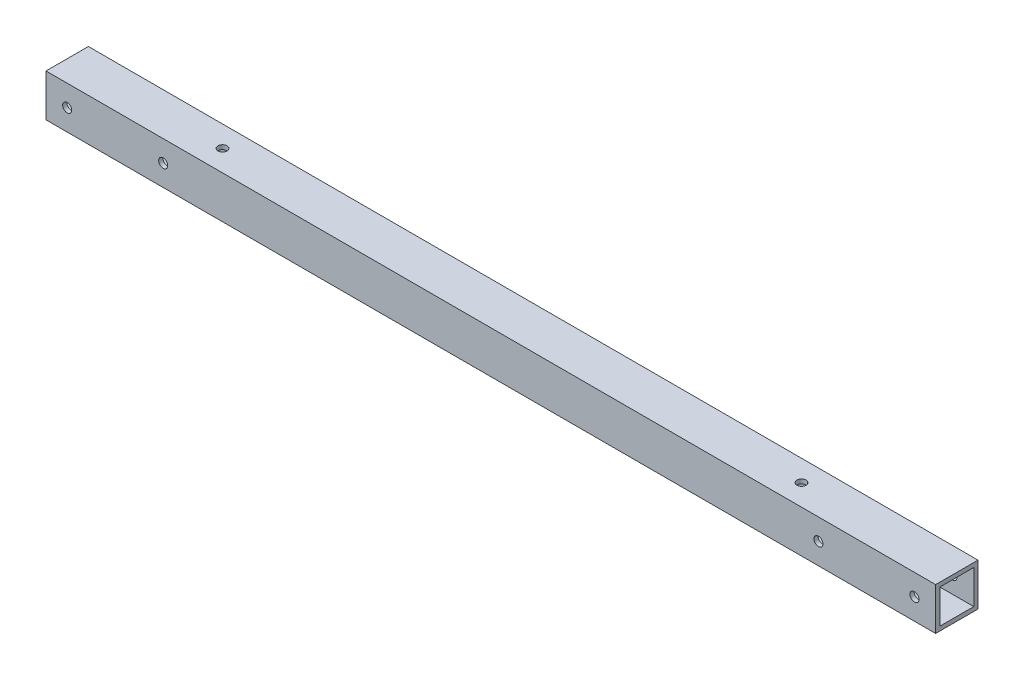
ISO-10303-21;
HEADER;
FILE_DESCRIPTION(('STEP AP214'),'2;1');
FILE_NAME('part.step','',(''),(''),'','','');
FILE_SCHEMA(('AUTOMOTIVE_DESIGN { 1 0 10303 214 1 1 1 1 }'));
ENDSEC;
DATA;
#1=APPLICATION_CONTEXT('core data for automotive mechanical design processes');
#2=APPLICATION_PROTOCOL_DEFINITION('international standard','automotive_design',2000,#1);
#3=PRODUCT_CONTEXT('',#1,'mechanical');
#4=PRODUCT('Part','Part','',(#3));
#5=PRODUCT_RELATED_PRODUCT_CATEGORY('part','',(#4));
#6=PRODUCT_DEFINITION_FORMATION('','',#4);
#7=PRODUCT_DEFINITION_CONTEXT('part definition',#1,'design');
#8=PRODUCT_DEFINITION('design','',#6,#7);
#9=PRODUCT_DEFINITION_SHAPE('','',#8);
#10=(LENGTH_UNIT() NAMED_UNIT(*) SI_UNIT(.MILLI.,.METRE.));
#11=(NAMED_UNIT(*) PLANE_ANGLE_UNIT() SI_UNIT($,.RADIAN.));
#12=(NAMED_UNIT(*) SI_UNIT($,.STERADIAN.) SOLID_ANGLE_UNIT());
#13=UNCERTAINTY_MEASURE_WITH_UNIT(LENGTH_MEASURE(1.E-05),#10,'distance_accuracy_value','');
#14=(GEOMETRIC_REPRESENTATION_CONTEXT(3) GLOBAL_UNCERTAINTY_ASSIGNED_CONTEXT((#13)) GLOBAL_UNIT_ASSIGNED_CONTEXT((#10,
#11,#12)) REPRESENTATION_CONTEXT('',''));
#15=CARTESIAN_POINT('',(0.,0.,0.));
#16=DIRECTION('',(0.,0.,1.));
#17=DIRECTION('',(1.,0.,0.));
#18=AXIS2_PLACEMENT_3D('',#15,#16,#17);
#19=CARTESIAN_POINT('',(7.5,-7.5,15.));
#20=DIRECTION('',(0.,0.,-1.));
#21=DIRECTION('',(-1.,0.,0.));
#22=AXIS2_PLACEMENT_3D('',#19,#20,#21);
#23=CYLINDRICAL_SURFACE('',#22,1.6);
#24=CARTESIAN_POINT('',(7.5,-7.5,13.5));
#25=DIRECTION('',(0.,0.,1.));
#26=DIRECTION('',(1.,0.,0.));
#27=AXIS2_PLACEMENT_3D('',#24,#25,#26);
#28=CIRCLE('',#27,1.6);
#29=CARTESIAN_POINT('',(9.1,-7.5,13.5));
#30=VERTEX_POINT('',#29);
#31=EDGE_CURVE('E166',#30,#30,#28,.T.);
#32=ORIENTED_EDGE('',*,*,#31,.F.);
#33=EDGE_LOOP('',(#32));
#34=FACE_BOUND('',#33,.T.);
#35=CARTESIAN_POINT('',(7.5,-7.5,15.));
#36=DIRECTION('',(0.,0.,1.));
#37=DIRECTION('',(1.,0.,0.));
#38=AXIS2_PLACEMENT_3D('',#35,#36,#37);
#39=CIRCLE('',#38,1.6);
#40=CARTESIAN_POINT('',(9.1,-7.5,15.));
#41=VERTEX_POINT('',#40);
#42=EDGE_CURVE('E188',#41,#41,#39,.T.);
#43=ORIENTED_EDGE('',*,*,#42,.T.);
#44=EDGE_LOOP('',(#43));
#45=FACE_BOUND('',#44,.T.);
#46=ADVANCED_FACE('F44',(#34,#45),#23,.F.);
#47=CARTESIAN_POINT('',(41.5,-7.5,15.));
#48=DIRECTION('',(0.,0.,-1.));
#49=DIRECTION('',(-1.,0.,0.));
#50=AXIS2_PLACEMENT_3D('',#47,#48,#49);
#51=CYLINDRICAL_SURFACE('',#50,1.6);
#52=CARTESIAN_POINT('',(41.5,-7.5,13.5));
#53=DIRECTION('',(0.,0.,1.));
#54=DIRECTION('',(1.,0.,0.));
#55=AXIS2_PLACEMENT_3D('',#52,#53,#54);
#56=CIRCLE('',#55,1.6);
#57=CARTESIAN_POINT('',(43.1,-7.5,13.5));
#58=VERTEX_POINT('',#57);
#59=EDGE_CURVE('E163',#58,#58,#56,.T.);
#60=ORIENTED_EDGE('',*,*,#59,.F.);
#61=EDGE_LOOP('',(#60));
#62=FACE_BOUND('',#61,.T.);
#63=CARTESIAN_POINT('',(41.5,-7.5,15.));
#64=DIRECTION('',(0.,0.,1.));
#65=DIRECTION('',(1.,0.,0.));
#66=AXIS2_PLACEMENT_3D('',#63,#64,#65);
#67=CIRCLE('',#66,1.6);
#68=CARTESIAN_POINT('',(43.1,-7.5,15.));
#69=VERTEX_POINT('',#68);
#70=EDGE_CURVE('E182',#69,#69,#67,.T.);
#71=ORIENTED_EDGE('',*,*,#70,.T.);
#72=EDGE_LOOP('',(#71));
#73=FACE_BOUND('',#72,.T.);
#74=ADVANCED_FACE('F277',(#62,#73),#51,.F.);
#75=CARTESIAN_POINT('',(273.5,-7.5,15.));
#76=DIRECTION('',(0.,0.,-1.));
#77=DIRECTION('',(-1.,0.,0.));
#78=AXIS2_PLACEMENT_3D('',#75,#76,#77);
#79=CYLINDRICAL_SURFACE('',#78,1.59999999999996);
#80=CARTESIAN_POINT('',(273.5,-7.5,13.5));
#81=DIRECTION('',(0.,0.,1.));
#82=DIRECTION('',(1.,0.,0.));
#83=AXIS2_PLACEMENT_3D('',#80,#81,#82);
#84=CIRCLE('',#83,1.59999999999996);
#85=CARTESIAN_POINT('',(275.1,-7.5,13.5));
#86=VERTEX_POINT('',#85);
#87=EDGE_CURVE('E160',#86,#86,#84,.T.);
#88=ORIENTED_EDGE('',*,*,#87,.F.);
#89=EDGE_LOOP('',(#88));
#90=FACE_BOUND('',#89,.T.);
#91=CARTESIAN_POINT('',(273.5,-7.5,15.));
#92=DIRECTION('',(0.,0.,1.));
#93=DIRECTION('',(1.,0.,0.));
#94=AXIS2_PLACEMENT_3D('',#91,#92,#93);
#95=CIRCLE('',#94,1.59999999999996);
#96=CARTESIAN_POINT('',(275.1,-7.5,15.));
#97=VERTEX_POINT('',#96);
#98=EDGE_CURVE('E176',#97,#97,#95,.T.);
#99=ORIENTED_EDGE('',*,*,#98,.T.);
#100=EDGE_LOOP('',(#99));
#101=FACE_BOUND('',#100,.T.);
#102=ADVANCED_FACE('F285',(#90,#101),#79,.F.);
#103=CARTESIAN_POINT('',(307.5,-7.5,15.));
#104=DIRECTION('',(0.,0.,-1.));
#105=DIRECTION('',(-1.,0.,0.));
#106=AXIS2_PLACEMENT_3D('',#103,#104,#105);
#107=CYLINDRICAL_SURFACE('',#106,1.59999999999996);
#108=CARTESIAN_POINT('',(307.5,-7.5,13.5));
#109=DIRECTION('',(0.,0.,1.));
#110=DIRECTION('',(1.,0.,0.));
#111=AXIS2_PLACEMENT_3D('',#108,#109,#110);
#112=CIRCLE('',#111,1.59999999999996);
#113=CARTESIAN_POINT('',(309.1,-7.5,13.5));
#114=VERTEX_POINT('',#113);
#115=EDGE_CURVE('E159',#114,#114,#112,.T.);
#116=ORIENTED_EDGE('',*,*,#115,.F.);
#117=EDGE_LOOP('',(#116));
#118=FACE_BOUND('',#117,.T.);
#119=CARTESIAN_POINT('',(307.5,-7.5,15.));
#120=DIRECTION('',(0.,0.,1.));
#121=DIRECTION('',(1.,0.,0.));
#122=AXIS2_PLACEMENT_3D('',#119,#120,#121);
#123=CIRCLE('',#122,1.59999999999996);
#124=CARTESIAN_POINT('',(309.1,-7.5,15.));
#125=VERTEX_POINT('',#124);
#126=EDGE_CURVE('E170',#125,#125,#123,.T.);
#127=ORIENTED_EDGE('',*,*,#126,.T.);
#128=EDGE_LOOP('',(#127));
#129=FACE_BOUND('',#128,.T.);
#130=ADVANCED_FACE('F273',(#118,#129),#107,.F.);
#131=CARTESIAN_POINT('',(0.,0.,15.));
#132=DIRECTION('',(0.,0.,1.));
#133=DIRECTION('',(1.,0.,0.));
#134=AXIS2_PLACEMENT_3D('',#131,#132,#133);
#135=PLANE('',#134);
#136=ORIENTED_EDGE('',*,*,#98,.F.);
#137=EDGE_LOOP('',(#136));
#138=FACE_BOUND('',#137,.T.);
#139=ORIENTED_EDGE('',*,*,#42,.F.);
#140=EDGE_LOOP('',(#139));
#141=FACE_BOUND('',#140,.T.);
#142=DIRECTION('',(0.,-1.,0.));
#143=VECTOR('',#142,1.);
#144=CARTESIAN_POINT('',(0.,0.,15.));
#145=LINE('',#144,#143);
#146=CARTESIAN_POINT('',(0.,0.,15.));
#147=VERTEX_POINT('',#146);
#148=CARTESIAN_POINT('',(0.,-15.,15.));
#149=VERTEX_POINT('',#148);
#150=EDGE_CURVE('E194',#147,#149,#145,.T.);
#151=ORIENTED_EDGE('',*,*,#150,.T.);
#152=DIRECTION('',(1.,0.,0.));
#153=VECTOR('',#152,1.);
#154=CARTESIAN_POINT('',(0.,-15.,15.));
#155=LINE('',#154,#153);
#156=CARTESIAN_POINT('',(315.,-15.,15.));
#157=VERTEX_POINT('',#156);
#158=EDGE_CURVE('E197',#149,#157,#155,.T.);
#159=ORIENTED_EDGE('',*,*,#158,.T.);
#160=DIRECTION('',(0.,1.,0.));
#161=VECTOR('',#160,1.);
#162=CARTESIAN_POINT('',(315.,0.,15.));
#163=LINE('',#162,#161);
#164=CARTESIAN_POINT('',(315.,0.,15.));
#165=VERTEX_POINT('',#164);
#166=EDGE_CURVE('E200',#157,#165,#163,.T.);
#167=ORIENTED_EDGE('',*,*,#166,.T.);
#168=DIRECTION('',(-1.,0.,0.));
#169=VECTOR('',#168,1.);
#170=CARTESIAN_POINT('',(0.,0.,15.));
#171=LINE('',#170,#169);
#172=EDGE_CURVE('E202',#165,#147,#171,.T.);
#173=ORIENTED_EDGE('',*,*,#172,.T.);
#174=EDGE_LOOP('',(#151,#159,#167,#173));
#175=FACE_BOUND('',#174,.T.);
#176=ORIENTED_EDGE('',*,*,#70,.F.);
#177=EDGE_LOOP('',(#176));
#178=FACE_BOUND('',#177,.T.);
#179=ORIENTED_EDGE('',*,*,#126,.F.);
#180=EDGE_LOOP('',(#179));
#181=FACE_BOUND('',#180,.T.);
#182=ADVANCED_FACE('F309',(#138,#141,#175,#178,#181),#135,.T.);
#183=CARTESIAN_POINT('',(0.,0.,0.));
#184=DIRECTION('',(0.,0.,1.));
#185=DIRECTION('',(1.,0.,0.));
#186=AXIS2_PLACEMENT_3D('',#183,#184,#185);
#187=PLANE('',#186);
#188=DIRECTION('',(0.,-1.,0.));
#189=VECTOR('',#188,1.);
#190=CARTESIAN_POINT('',(0.,0.,0.));
#191=LINE('',#190,#189);
#192=CARTESIAN_POINT('',(0.,0.,0.));
#193=VERTEX_POINT('',#192);
#194=CARTESIAN_POINT('',(0.,-15.,0.));
#195=VERTEX_POINT('',#194);
#196=EDGE_CURVE('E191',#193,#195,#191,.T.);
#197=ORIENTED_EDGE('',*,*,#196,.F.);
#198=DIRECTION('',(-1.,0.,0.));
#199=VECTOR('',#198,1.);
#200=CARTESIAN_POINT('',(0.,0.,0.));
#201=LINE('',#200,#199);
#202=CARTESIAN_POINT('',(315.,0.,0.));
#203=VERTEX_POINT('',#202);
#204=EDGE_CURVE('E198',#203,#193,#201,.T.);
#205=ORIENTED_EDGE('',*,*,#204,.F.);
#206=DIRECTION('',(0.,1.,0.));
#207=VECTOR('',#206,1.);
#208=CARTESIAN_POINT('',(315.,0.,0.));
#209=LINE('',#208,#207);
#210=CARTESIAN_POINT('',(315.,-15.,0.));
#211=VERTEX_POINT('',#210);
#212=EDGE_CURVE('E209',#211,#203,#209,.T.);
#213=ORIENTED_EDGE('',*,*,#212,.F.);
#214=DIRECTION('',(1.,0.,0.));
#215=VECTOR('',#214,1.);
#216=CARTESIAN_POINT('',(0.,-15.,0.));
#217=LINE('',#216,#215);
#218=EDGE_CURVE('E207',#195,#211,#217,.T.);
#219=ORIENTED_EDGE('',*,*,#218,.F.);
#220=EDGE_LOOP('',(#197,#205,#213,#219));
#221=FACE_BOUND('',#220,.T.);
#222=CARTESIAN_POINT('',(7.5,-7.5,0.));
#223=DIRECTION('',(0.,0.,1.));
#224=DIRECTION('',(1.,0.,0.));
#225=AXIS2_PLACEMENT_3D('',#222,#223,#224);
#226=CIRCLE('',#225,1.6);
#227=CARTESIAN_POINT('',(9.1,-7.5,0.));
#228=VERTEX_POINT('',#227);
#229=EDGE_CURVE('E185',#228,#228,#226,.T.);
#230=ORIENTED_EDGE('',*,*,#229,.T.);
#231=EDGE_LOOP('',(#230));
#232=FACE_BOUND('',#231,.T.);
#233=CARTESIAN_POINT('',(41.5,-7.5,0.));
#234=DIRECTION('',(0.,0.,1.));
#235=DIRECTION('',(1.,0.,0.));
#236=AXIS2_PLACEMENT_3D('',#233,#234,#235);
#237=CIRCLE('',#236,1.6);
#238=CARTESIAN_POINT('',(43.1,-7.5,0.));
#239=VERTEX_POINT('',#238);
#240=EDGE_CURVE('E179',#239,#239,#237,.T.);
#241=ORIENTED_EDGE('',*,*,#240,.T.);
#242=EDGE_LOOP('',(#241));
#243=FACE_BOUND('',#242,.T.);
#244=CARTESIAN_POINT('',(273.5,-7.5,0.));
#245=DIRECTION('',(0.,0.,1.));
#246=DIRECTION('',(1.,0.,0.));
#247=AXIS2_PLACEMENT_3D('',#244,#245,#246);
#248=CIRCLE('',#247,1.59999999999996);
#249=CARTESIAN_POINT('',(275.1,-7.5,0.));
#250=VERTEX_POINT('',#249);
#251=EDGE_CURVE('E173',#250,#250,#248,.T.);
#252=ORIENTED_EDGE('',*,*,#251,.T.);
#253=EDGE_LOOP('',(#252));
#254=FACE_BOUND('',#253,.T.);
#255=CARTESIAN_POINT('',(307.5,-7.5,0.));
#256=DIRECTION('',(0.,0.,1.));
#257=DIRECTION('',(1.,0.,0.));
#258=AXIS2_PLACEMENT_3D('',#255,#256,#257);
#259=CIRCLE('',#258,1.59999999999996);
#260=CARTESIAN_POINT('',(309.1,-7.5,0.));
#261=VERTEX_POINT('',#260);
#262=EDGE_CURVE('E169',#261,#261,#259,.T.);
#263=ORIENTED_EDGE('',*,*,#262,.T.);
#264=EDGE_LOOP('',(#263));
#265=FACE_BOUND('',#264,.T.);
#266=ADVANCED_FACE('F307',(#221,#232,#243,#254,#265),#187,.F.);
#267=CARTESIAN_POINT('',(0.,0.,15.));
#268=DIRECTION('',(1.,0.,0.));
#269=DIRECTION('',(0.,0.,-1.));
#270=AXIS2_PLACEMENT_3D('',#267,#268,#269);
#271=PLANE('',#270);
#272=DIRECTION('',(0.,-1.,0.));
#273=VECTOR('',#272,1.);
#274=CARTESIAN_POINT('',(0.,-1.5,13.5));
#275=LINE('',#274,#273);
#276=CARTESIAN_POINT('',(0.,-1.5,13.5));
#277=VERTEX_POINT('',#276);
#278=CARTESIAN_POINT('',(0.,-13.5,13.5));
#279=VERTEX_POINT('',#278);
#280=EDGE_CURVE('E119',#277,#279,#275,.T.);
#281=ORIENTED_EDGE('',*,*,#280,.T.);
#282=DIRECTION('',(0.,0.,-1.));
#283=VECTOR('',#282,1.);
#284=CARTESIAN_POINT('',(0.,-13.5,13.5));
#285=LINE('',#284,#283);
#286=CARTESIAN_POINT('',(0.,-13.5,1.5));
#287=VERTEX_POINT('',#286);
#288=EDGE_CURVE('E113',#279,#287,#285,.T.);
#289=ORIENTED_EDGE('',*,*,#288,.T.);
#290=DIRECTION('',(0.,1.,0.));
#291=VECTOR('',#290,1.);
#292=CARTESIAN_POINT('',(0.,-13.5,1.5));
#293=LINE('',#292,#291);
#294=CARTESIAN_POINT('',(0.,-1.5,1.5));
#295=VERTEX_POINT('',#294);
#296=EDGE_CURVE('E122',#287,#295,#293,.T.);
#297=ORIENTED_EDGE('',*,*,#296,.T.);
#298=DIRECTION('',(0.,0.,1.));
#299=VECTOR('',#298,1.);
#300=CARTESIAN_POINT('',(0.,-1.5,1.5));
#301=LINE('',#300,#299);
#302=EDGE_CURVE('E61',#295,#277,#301,.T.);
#303=ORIENTED_EDGE('',*,*,#302,.T.);
#304=EDGE_LOOP('',(#281,#289,#297,#303));
#305=FACE_BOUND('',#304,.T.);
#306=ORIENTED_EDGE('',*,*,#196,.T.);
#307=DIRECTION('',(0.,0.,-1.));
#308=VECTOR('',#307,1.);
#309=CARTESIAN_POINT('',(0.,-15.,15.));
#310=LINE('',#309,#308);
#311=EDGE_CURVE('E11',#149,#195,#310,.T.);
#312=ORIENTED_EDGE('',*,*,#311,.F.);
#313=ORIENTED_EDGE('',*,*,#150,.F.);
#314=DIRECTION('',(0.,0.,-1.));
#315=VECTOR('',#314,1.);
#316=CARTESIAN_POINT('',(0.,0.,15.));
#317=LINE('',#316,#315);
#318=EDGE_CURVE('E204',#147,#193,#317,.T.);
#319=ORIENTED_EDGE('',*,*,#318,.T.);
#320=EDGE_LOOP('',(#306,#312,#313,#319));
#321=FACE_BOUND('',#320,.T.);
#322=ADVANCED_FACE('F46',(#305,#321),#271,.F.);
#323=CARTESIAN_POINT('',(0.,-15.,15.));
#324=DIRECTION('',(0.,1.,0.));
#325=DIRECTION('',(0.,0.,1.));
#326=AXIS2_PLACEMENT_3D('',#323,#324,#325);
#327=PLANE('',#326);
#328=CARTESIAN_POINT('',(55.,-15.,7.50000000000003));
#329=DIRECTION('',(0.,1.,0.));
#330=DIRECTION('',(0.,0.,1.));
#331=AXIS2_PLACEMENT_3D('',#328,#329,#330);
#332=CIRCLE('',#331,1.60000000000001);
#333=CARTESIAN_POINT('',(55.,-15.,9.10000000000004));
#334=VERTEX_POINT('',#333);
#335=EDGE_CURVE('E225',#334,#334,#332,.T.);
#336=ORIENTED_EDGE('',*,*,#335,.T.);
#337=EDGE_LOOP('',(#336));
#338=FACE_BOUND('',#337,.T.);
#339=CARTESIAN_POINT('',(260.,-15.,7.50000000000001));
#340=DIRECTION('',(0.,1.,0.));
#341=DIRECTION('',(0.,0.,1.));
#342=AXIS2_PLACEMENT_3D('',#339,#340,#341);
#343=CIRCLE('',#342,1.59999999999996);
#344=CARTESIAN_POINT('',(260.,-15.,9.09999999999997));
#345=VERTEX_POINT('',#344);
#346=EDGE_CURVE('E240',#345,#345,#343,.T.);
#347=ORIENTED_EDGE('',*,*,#346,.T.);
#348=EDGE_LOOP('',(#347));
#349=FACE_BOUND('',#348,.T.);
#350=ORIENTED_EDGE('',*,*,#218,.T.);
#351=DIRECTION('',(0.,0.,-1.));
#352=VECTOR('',#351,1.);
#353=CARTESIAN_POINT('',(315.,-15.,15.));
#354=LINE('',#353,#352);
#355=EDGE_CURVE('E53',#157,#211,#354,.T.);
#356=ORIENTED_EDGE('',*,*,#355,.F.);
#357=ORIENTED_EDGE('',*,*,#158,.F.);
#358=ORIENTED_EDGE('',*,*,#311,.T.);
#359=EDGE_LOOP('',(#350,#356,#357,#358));
#360=FACE_BOUND('',#359,.T.);
#361=ADVANCED_FACE('F244',(#338,#349,#360),#327,.F.);
#362=CARTESIAN_POINT('',(315.,0.,15.));
#363=DIRECTION('',(-1.,0.,0.));
#364=DIRECTION('',(0.,0.,1.));
#365=AXIS2_PLACEMENT_3D('',#362,#363,#364);
#366=PLANE('',#365);
#367=DIRECTION('',(0.,1.,0.));
#368=VECTOR('',#367,1.);
#369=CARTESIAN_POINT('',(315.,-13.5,1.5));
#370=LINE('',#369,#368);
#371=CARTESIAN_POINT('',(315.,-13.5,1.5));
#372=VERTEX_POINT('',#371);
#373=CARTESIAN_POINT('',(315.,-1.5,1.5));
#374=VERTEX_POINT('',#373);
#375=EDGE_CURVE('E140',#372,#374,#370,.T.);
#376=ORIENTED_EDGE('',*,*,#375,.F.);
#377=DIRECTION('',(0.,0.,-1.));
#378=VECTOR('',#377,1.);
#379=CARTESIAN_POINT('',(315.,-13.5,13.5));
#380=LINE('',#379,#378);
#381=CARTESIAN_POINT('',(315.,-13.5,13.5));
#382=VERTEX_POINT('',#381);
#383=EDGE_CURVE('E69',#382,#372,#380,.T.);
#384=ORIENTED_EDGE('',*,*,#383,.F.);
#385=DIRECTION('',(0.,-1.,0.));
#386=VECTOR('',#385,1.);
#387=CARTESIAN_POINT('',(315.,-1.5,13.5));
#388=LINE('',#387,#386);
#389=CARTESIAN_POINT('',(315.,-1.5,13.5));
#390=VERTEX_POINT('',#389);
#391=EDGE_CURVE('E128',#390,#382,#388,.T.);
#392=ORIENTED_EDGE('',*,*,#391,.F.);
#393=DIRECTION('',(0.,0.,1.));
#394=VECTOR('',#393,1.);
#395=CARTESIAN_POINT('',(315.,-1.5,1.5));
#396=LINE('',#395,#394);
#397=EDGE_CURVE('E131',#374,#390,#396,.T.);
#398=ORIENTED_EDGE('',*,*,#397,.F.);
#399=EDGE_LOOP('',(#376,#384,#392,#398));
#400=FACE_BOUND('',#399,.T.);
#401=ORIENTED_EDGE('',*,*,#212,.T.);
#402=DIRECTION('',(0.,0.,-1.));
#403=VECTOR('',#402,1.);
#404=CARTESIAN_POINT('',(315.,0.,15.));
#405=LINE('',#404,#403);
#406=EDGE_CURVE('E214',#165,#203,#405,.T.);
#407=ORIENTED_EDGE('',*,*,#406,.F.);
#408=ORIENTED_EDGE('',*,*,#166,.F.);
#409=ORIENTED_EDGE('',*,*,#355,.T.);
#410=EDGE_LOOP('',(#401,#407,#408,#409));
#411=FACE_BOUND('',#410,.T.);
#412=ADVANCED_FACE('F300',(#400,#411),#366,.F.);
#413=CARTESIAN_POINT('',(0.,0.,15.));
#414=DIRECTION('',(0.,-1.,0.));
#415=DIRECTION('',(0.,0.,-1.));
#416=AXIS2_PLACEMENT_3D('',#413,#414,#415);
#417=PLANE('',#416);
#418=CARTESIAN_POINT('',(55.,0.,7.50000000000003));
#419=DIRECTION('',(0.,1.,0.));
#420=DIRECTION('',(0.,0.,1.));
#421=AXIS2_PLACEMENT_3D('',#418,#419,#420);
#422=CIRCLE('',#421,1.60000000000001);
#423=CARTESIAN_POINT('',(55.,0.,9.10000000000004));
#424=VERTEX_POINT('',#423);
#425=EDGE_CURVE('E230',#424,#424,#422,.T.);
#426=ORIENTED_EDGE('',*,*,#425,.F.);
#427=EDGE_LOOP('',(#426));
#428=FACE_BOUND('',#427,.T.);
#429=CARTESIAN_POINT('',(260.,0.,7.50000000000001));
#430=DIRECTION('',(0.,1.,0.));
#431=DIRECTION('',(0.,0.,1.));
#432=AXIS2_PLACEMENT_3D('',#429,#430,#431);
#433=CIRCLE('',#432,1.59999999999996);
#434=CARTESIAN_POINT('',(260.,0.,9.09999999999997));
#435=VERTEX_POINT('',#434);
#436=EDGE_CURVE('E235',#435,#435,#433,.T.);
#437=ORIENTED_EDGE('',*,*,#436,.F.);
#438=EDGE_LOOP('',(#437));
#439=FACE_BOUND('',#438,.T.);
#440=ORIENTED_EDGE('',*,*,#204,.T.);
#441=ORIENTED_EDGE('',*,*,#318,.F.);
#442=ORIENTED_EDGE('',*,*,#172,.F.);
#443=ORIENTED_EDGE('',*,*,#406,.T.);
#444=EDGE_LOOP('',(#440,#441,#442,#443));
#445=FACE_BOUND('',#444,.T.);
#446=ADVANCED_FACE('F293',(#428,#439,#445),#417,.F.);
#447=CARTESIAN_POINT('',(7.5,-7.5,1.5));
#448=DIRECTION('',(0.,0.,-1.));
#449=DIRECTION('',(-1.,0.,0.));
#450=AXIS2_PLACEMENT_3D('',#447,#448,#449);
#451=CIRCLE('',#450,1.6);
#452=CARTESIAN_POINT('',(5.9,-7.5,1.5));
#453=VERTEX_POINT('',#452);
#454=EDGE_CURVE('E156',#453,#453,#451,.T.);
#455=ORIENTED_EDGE('',*,*,#454,.F.);
#456=EDGE_LOOP('',(#455));
#457=FACE_BOUND('',#456,.T.);
#458=ORIENTED_EDGE('',*,*,#229,.F.);
#459=EDGE_LOOP('',(#458));
#460=FACE_BOUND('',#459,.T.);
#461=ADVANCED_FACE('F280',(#457,#460),#23,.F.);
#462=CARTESIAN_POINT('',(41.5,-7.5,1.5));
#463=DIRECTION('',(0.,0.,-1.));
#464=DIRECTION('',(-1.,0.,0.));
#465=AXIS2_PLACEMENT_3D('',#462,#463,#464);
#466=CIRCLE('',#465,1.6);
#467=CARTESIAN_POINT('',(39.9,-7.5,1.5));
#468=VERTEX_POINT('',#467);
#469=EDGE_CURVE('E153',#468,#468,#466,.T.);
#470=ORIENTED_EDGE('',*,*,#469,.F.);
#471=EDGE_LOOP('',(#470));
#472=FACE_BOUND('',#471,.T.);
#473=ORIENTED_EDGE('',*,*,#240,.F.);
#474=EDGE_LOOP('',(#473));
#475=FACE_BOUND('',#474,.T.);
#476=ADVANCED_FACE('F288',(#472,#475),#51,.F.);
#477=CARTESIAN_POINT('',(273.5,-7.5,1.5));
#478=DIRECTION('',(0.,0.,-1.));
#479=DIRECTION('',(-1.,0.,0.));
#480=AXIS2_PLACEMENT_3D('',#477,#478,#479);
#481=CIRCLE('',#480,1.59999999999996);
#482=CARTESIAN_POINT('',(271.9,-7.5,1.5));
#483=VERTEX_POINT('',#482);
#484=EDGE_CURVE('E150',#483,#483,#481,.T.);
#485=ORIENTED_EDGE('',*,*,#484,.F.);
#486=EDGE_LOOP('',(#485));
#487=FACE_BOUND('',#486,.T.);
#488=ORIENTED_EDGE('',*,*,#251,.F.);
#489=EDGE_LOOP('',(#488));
#490=FACE_BOUND('',#489,.T.);
#491=ADVANCED_FACE('F270',(#487,#490),#79,.F.);
#492=CARTESIAN_POINT('',(307.5,-7.5,1.5));
#493=DIRECTION('',(0.,0.,-1.));
#494=DIRECTION('',(-1.,0.,0.));
#495=AXIS2_PLACEMENT_3D('',#492,#493,#494);
#496=CIRCLE('',#495,1.59999999999996);
#497=CARTESIAN_POINT('',(305.9,-7.5,1.5));
#498=VERTEX_POINT('',#497);
#499=EDGE_CURVE('E146',#498,#498,#496,.T.);
#500=ORIENTED_EDGE('',*,*,#499,.F.);
#501=EDGE_LOOP('',(#500));
#502=FACE_BOUND('',#501,.T.);
#503=ORIENTED_EDGE('',*,*,#262,.F.);
#504=EDGE_LOOP('',(#503));
#505=FACE_BOUND('',#504,.T.);
#506=ADVANCED_FACE('F258',(#502,#505),#107,.F.);
#507=CARTESIAN_POINT('',(0.,-13.5,13.5));
#508=DIRECTION('',(0.,-1.,0.));
#509=DIRECTION('',(0.,0.,-1.));
#510=AXIS2_PLACEMENT_3D('',#507,#508,#509);
#511=PLANE('',#510);
#512=CARTESIAN_POINT('',(55.,-13.5,7.50000000000003));
#513=DIRECTION('',(0.,-1.,0.));
#514=DIRECTION('',(0.,0.,-1.));
#515=AXIS2_PLACEMENT_3D('',#512,#513,#514);
#516=CIRCLE('',#515,1.60000000000001);
#517=CARTESIAN_POINT('',(55.,-13.5,5.90000000000003));
#518=VERTEX_POINT('',#517);
#519=EDGE_CURVE('E134',#518,#518,#516,.T.);
#520=ORIENTED_EDGE('',*,*,#519,.T.);
#521=EDGE_LOOP('',(#520));
#522=FACE_BOUND('',#521,.T.);
#523=CARTESIAN_POINT('',(260.,-13.5,7.50000000000001));
#524=DIRECTION('',(0.,-1.,0.));
#525=DIRECTION('',(0.,0.,-1.));
#526=AXIS2_PLACEMENT_3D('',#523,#524,#525);
#527=CIRCLE('',#526,1.59999999999996);
#528=CARTESIAN_POINT('',(260.,-13.5,5.90000000000004));
#529=VERTEX_POINT('',#528);
#530=EDGE_CURVE('E224',#529,#529,#527,.T.);
#531=ORIENTED_EDGE('',*,*,#530,.T.);
#532=EDGE_LOOP('',(#531));
#533=FACE_BOUND('',#532,.T.);
#534=ORIENTED_EDGE('',*,*,#383,.T.);
#535=DIRECTION('',(1.,0.,0.));
#536=VECTOR('',#535,1.);
#537=CARTESIAN_POINT('',(0.,-13.5,1.5));
#538=LINE('',#537,#536);
#539=EDGE_CURVE('E109',#287,#372,#538,.T.);
#540=ORIENTED_EDGE('',*,*,#539,.F.);
#541=ORIENTED_EDGE('',*,*,#288,.F.);
#542=DIRECTION('',(1.,0.,0.));
#543=VECTOR('',#542,1.);
#544=CARTESIAN_POINT('',(0.,-13.5,13.5));
#545=LINE('',#544,#543);
#546=EDGE_CURVE('E144',#279,#382,#545,.T.);
#547=ORIENTED_EDGE('',*,*,#546,.T.);
#548=EDGE_LOOP('',(#534,#540,#541,#547));
#549=FACE_BOUND('',#548,.T.);
#550=ADVANCED_FACE('F111',(#522,#533,#549),#511,.F.);
#551=CARTESIAN_POINT('',(0.,-1.5,13.5));
#552=DIRECTION('',(0.,0.,1.));
#553=DIRECTION('',(1.,0.,0.));
#554=AXIS2_PLACEMENT_3D('',#551,#552,#553);
#555=PLANE('',#554);
#556=ORIENTED_EDGE('',*,*,#31,.T.);
#557=EDGE_LOOP('',(#556));
#558=FACE_BOUND('',#557,.T.);
#559=ORIENTED_EDGE('',*,*,#59,.T.);
#560=EDGE_LOOP('',(#559));
#561=FACE_BOUND('',#560,.T.);
#562=ORIENTED_EDGE('',*,*,#87,.T.);
#563=EDGE_LOOP('',(#562));
#564=FACE_BOUND('',#563,.T.);
#565=ORIENTED_EDGE('',*,*,#115,.T.);
#566=EDGE_LOOP('',(#565));
#567=FACE_BOUND('',#566,.T.);
#568=ORIENTED_EDGE('',*,*,#391,.T.);
#569=ORIENTED_EDGE('',*,*,#546,.F.);
#570=ORIENTED_EDGE('',*,*,#280,.F.);
#571=DIRECTION('',(1.,0.,0.));
#572=VECTOR('',#571,1.);
#573=CARTESIAN_POINT('',(0.,-1.5,13.5));
#574=LINE('',#573,#572);
#575=EDGE_CURVE('E147',#277,#390,#574,.T.);
#576=ORIENTED_EDGE('',*,*,#575,.T.);
#577=EDGE_LOOP('',(#568,#569,#570,#576));
#578=FACE_BOUND('',#577,.T.);
#579=ADVANCED_FACE('F257',(#558,#561,#564,#567,#578),#555,.F.);
#580=CARTESIAN_POINT('',(0.,-1.5,1.5));
#581=DIRECTION('',(0.,1.,0.));
#582=DIRECTION('',(0.,0.,1.));
#583=AXIS2_PLACEMENT_3D('',#580,#581,#582);
#584=PLANE('',#583);
#585=CARTESIAN_POINT('',(55.,-1.5,7.50000000000003));
#586=DIRECTION('',(0.,1.,0.));
#587=DIRECTION('',(0.,0.,1.));
#588=AXIS2_PLACEMENT_3D('',#585,#586,#587);
#589=CIRCLE('',#588,1.60000000000001);
#590=CARTESIAN_POINT('',(55.,-1.5,9.10000000000004));
#591=VERTEX_POINT('',#590);
#592=EDGE_CURVE('E48',#591,#591,#589,.T.);
#593=ORIENTED_EDGE('',*,*,#592,.T.);
#594=EDGE_LOOP('',(#593));
#595=FACE_BOUND('',#594,.T.);
#596=CARTESIAN_POINT('',(260.,-1.5,7.50000000000001));
#597=DIRECTION('',(0.,1.,0.));
#598=DIRECTION('',(0.,0.,1.));
#599=AXIS2_PLACEMENT_3D('',#596,#597,#598);
#600=CIRCLE('',#599,1.59999999999996);
#601=CARTESIAN_POINT('',(260.,-1.5,9.09999999999997));
#602=VERTEX_POINT('',#601);
#603=EDGE_CURVE('E222',#602,#602,#600,.T.);
#604=ORIENTED_EDGE('',*,*,#603,.T.);
#605=EDGE_LOOP('',(#604));
#606=FACE_BOUND('',#605,.T.);
#607=ORIENTED_EDGE('',*,*,#397,.T.);
#608=ORIENTED_EDGE('',*,*,#575,.F.);
#609=ORIENTED_EDGE('',*,*,#302,.F.);
#610=DIRECTION('',(1.,0.,0.));
#611=VECTOR('',#610,1.);
#612=CARTESIAN_POINT('',(0.,-1.5,1.5));
#613=LINE('',#612,#611);
#614=EDGE_CURVE('E118',#295,#374,#613,.T.);
#615=ORIENTED_EDGE('',*,*,#614,.T.);
#616=EDGE_LOOP('',(#607,#608,#609,#615));
#617=FACE_BOUND('',#616,.T.);
#618=ADVANCED_FACE('F266',(#595,#606,#617),#584,.F.);
#619=CARTESIAN_POINT('',(0.,-13.5,1.5));
#620=DIRECTION('',(0.,0.,-1.));
#621=DIRECTION('',(-1.,0.,0.));
#622=AXIS2_PLACEMENT_3D('',#619,#620,#621);
#623=PLANE('',#622);
#624=ORIENTED_EDGE('',*,*,#454,.T.);
#625=EDGE_LOOP('',(#624));
#626=FACE_BOUND('',#625,.T.);
#627=ORIENTED_EDGE('',*,*,#469,.T.);
#628=EDGE_LOOP('',(#627));
#629=FACE_BOUND('',#628,.T.);
#630=ORIENTED_EDGE('',*,*,#484,.T.);
#631=EDGE_LOOP('',(#630));
#632=FACE_BOUND('',#631,.T.);
#633=ORIENTED_EDGE('',*,*,#499,.T.);
#634=EDGE_LOOP('',(#633));
#635=FACE_BOUND('',#634,.T.);
#636=ORIENTED_EDGE('',*,*,#375,.T.);
#637=ORIENTED_EDGE('',*,*,#614,.F.);
#638=ORIENTED_EDGE('',*,*,#296,.F.);
#639=ORIENTED_EDGE('',*,*,#539,.T.);
#640=EDGE_LOOP('',(#636,#637,#638,#639));
#641=FACE_BOUND('',#640,.T.);
#642=ADVANCED_FACE('F123',(#626,#629,#632,#635,#641),#623,.F.);
#643=CARTESIAN_POINT('',(260.,-15.,7.50000000000001));
#644=DIRECTION('',(0.,1.,0.));
#645=DIRECTION('',(0.,0.,1.));
#646=AXIS2_PLACEMENT_3D('',#643,#644,#645);
#647=CYLINDRICAL_SURFACE('',#646,1.59999999999996);
#648=ORIENTED_EDGE('',*,*,#436,.T.);
#649=EDGE_LOOP('',(#648));
#650=FACE_BOUND('',#649,.T.);
#651=ORIENTED_EDGE('',*,*,#603,.F.);
#652=EDGE_LOOP('',(#651));
#653=FACE_BOUND('',#652,.T.);
#654=ADVANCED_FACE('F253',(#650,#653),#647,.F.);
#655=CARTESIAN_POINT('',(55.,-15.,7.50000000000003));
#656=DIRECTION('',(0.,1.,0.));
#657=DIRECTION('',(0.,0.,1.));
#658=AXIS2_PLACEMENT_3D('',#655,#656,#657);
#659=CYLINDRICAL_SURFACE('',#658,1.60000000000001);
#660=ORIENTED_EDGE('',*,*,#425,.T.);
#661=EDGE_LOOP('',(#660));
#662=FACE_BOUND('',#661,.T.);
#663=ORIENTED_EDGE('',*,*,#592,.F.);
#664=EDGE_LOOP('',(#663));
#665=FACE_BOUND('',#664,.T.);
#666=ADVANCED_FACE('F251',(#662,#665),#659,.F.);
#667=ORIENTED_EDGE('',*,*,#346,.F.);
#668=EDGE_LOOP('',(#667));
#669=FACE_BOUND('',#668,.T.);
#670=ORIENTED_EDGE('',*,*,#530,.F.);
#671=EDGE_LOOP('',(#670));
#672=FACE_BOUND('',#671,.T.);
#673=ADVANCED_FACE('F247',(#669,#672),#647,.F.);
#674=ORIENTED_EDGE('',*,*,#335,.F.);
#675=EDGE_LOOP('',(#674));
#676=FACE_BOUND('',#675,.T.);
#677=ORIENTED_EDGE('',*,*,#519,.F.);
#678=EDGE_LOOP('',(#677));
#679=FACE_BOUND('',#678,.T.);
#680=ADVANCED_FACE('F250',(#676,#679),#659,.F.);
#681=CLOSED_SHELL('',(#46,#74,#102,#130,#182,#266,#322,#361,#412,#446,#461,#476,#491,#506,#550,
#579,#618,#642,#654,#666,#673,#680));
#682=MANIFOLD_SOLID_BREP('B2',#681);
#683=ADVANCED_BREP_SHAPE_REPRESENTATION('',(#18,#682),#14);
#684=SHAPE_DEFINITION_REPRESENTATION(#9,#683);
ENDSEC;
END-ISO-10303-21;
